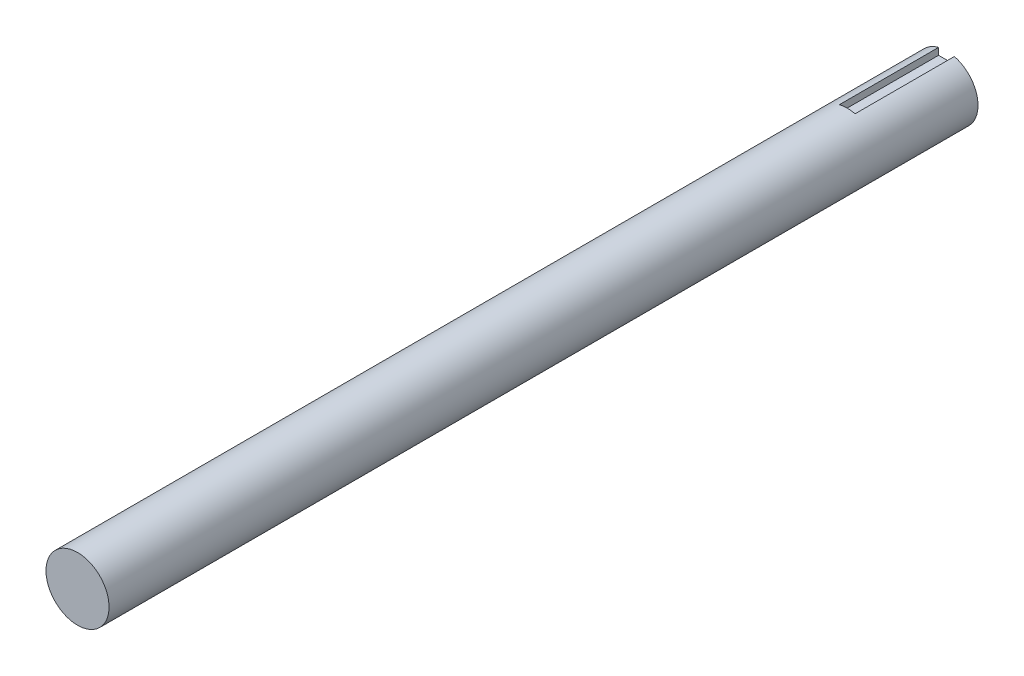
ISO-10303-21;
HEADER;
FILE_DESCRIPTION(('STEP AP214'),'2;1');
FILE_NAME('part.step','',(''),(''),'','','');
FILE_SCHEMA(('AUTOMOTIVE_DESIGN { 1 0 10303 214 1 1 1 1 }'));
ENDSEC;
DATA;
#1=APPLICATION_CONTEXT('core data for automotive mechanical design processes');
#2=APPLICATION_PROTOCOL_DEFINITION('international standard','automotive_design',2000,#1);
#3=PRODUCT_CONTEXT('',#1,'mechanical');
#4=PRODUCT('Part','Part','',(#3));
#5=PRODUCT_RELATED_PRODUCT_CATEGORY('part','',(#4));
#6=PRODUCT_DEFINITION_FORMATION('','',#4);
#7=PRODUCT_DEFINITION_CONTEXT('part definition',#1,'design');
#8=PRODUCT_DEFINITION('design','',#6,#7);
#9=PRODUCT_DEFINITION_SHAPE('','',#8);
#10=(LENGTH_UNIT() NAMED_UNIT(*) SI_UNIT(.MILLI.,.METRE.));
#11=(NAMED_UNIT(*) PLANE_ANGLE_UNIT() SI_UNIT($,.RADIAN.));
#12=(NAMED_UNIT(*) SI_UNIT($,.STERADIAN.) SOLID_ANGLE_UNIT());
#13=UNCERTAINTY_MEASURE_WITH_UNIT(LENGTH_MEASURE(1.E-05),#10,'distance_accuracy_value','');
#14=(GEOMETRIC_REPRESENTATION_CONTEXT(3) GLOBAL_UNCERTAINTY_ASSIGNED_CONTEXT((#13)) GLOBAL_UNIT_ASSIGNED_CONTEXT((#10,
#11,#12)) REPRESENTATION_CONTEXT('',''));
#15=CARTESIAN_POINT('',(0.,0.,0.));
#16=DIRECTION('',(0.,0.,1.));
#17=DIRECTION('',(1.,0.,0.));
#18=AXIS2_PLACEMENT_3D('',#15,#16,#17);
#19=CARTESIAN_POINT('',(0.,0.,155.));
#20=DIRECTION('',(0.,0.,1.));
#21=DIRECTION('',(1.,0.,0.));
#22=AXIS2_PLACEMENT_3D('',#19,#20,#21);
#23=CYLINDRICAL_SURFACE('',#22,12.7);
#24=CARTESIAN_POINT('',(0.,0.,-150.));
#25=DIRECTION('',(0.,0.,1.));
#26=DIRECTION('',(1.,0.,0.));
#27=AXIS2_PLACEMENT_3D('',#24,#25,#26);
#28=CIRCLE('',#27,12.7);
#29=CARTESIAN_POINT('',(3.175,12.2967221242085,-150.));
#30=VERTEX_POINT('',#29);
#31=CARTESIAN_POINT('',(-3.175,12.2967221242085,-150.));
#32=VERTEX_POINT('',#31);
#33=EDGE_CURVE('E48',#30,#32,#28,.T.);
#34=ORIENTED_EDGE('',*,*,#33,.T.);
#35=DIRECTION('',(0.,0.,-1.));
#36=VECTOR('',#35,1.);
#37=CARTESIAN_POINT('',(-3.175,12.2967221242085,-155.));
#38=LINE('',#37,#36);
#39=CARTESIAN_POINT('',(-3.175,12.2967221242085,-190.));
#40=VERTEX_POINT('',#39);
#41=EDGE_CURVE('E81',#40,#32,#38,.F.);
#42=ORIENTED_EDGE('',*,*,#41,.F.);
#43=CARTESIAN_POINT('',(0.,0.,-190.));
#44=DIRECTION('',(0.,0.,-1.));
#45=DIRECTION('',(-1.,0.,0.));
#46=AXIS2_PLACEMENT_3D('',#43,#44,#45);
#47=CIRCLE('',#46,12.7);
#48=CARTESIAN_POINT('',(3.175,12.2967221242085,-190.));
#49=VERTEX_POINT('',#48);
#50=EDGE_CURVE('E77',#49,#40,#47,.T.);
#51=ORIENTED_EDGE('',*,*,#50,.F.);
#52=DIRECTION('',(0.,0.,-1.));
#53=VECTOR('',#52,1.);
#54=CARTESIAN_POINT('',(3.175,12.2967221242085,-155.));
#55=LINE('',#54,#53);
#56=EDGE_CURVE('E74',#30,#49,#55,.T.);
#57=ORIENTED_EDGE('',*,*,#56,.F.);
#58=EDGE_LOOP('',(#34,#42,#51,#57));
#59=FACE_BOUND('',#58,.T.);
#60=CARTESIAN_POINT('',(0.,0.,160.));
#61=DIRECTION('',(0.,0.,-1.));
#62=DIRECTION('',(-1.,0.,0.));
#63=AXIS2_PLACEMENT_3D('',#60,#61,#62);
#64=CIRCLE('',#63,12.7);
#65=CARTESIAN_POINT('',(-12.7,0.,160.));
#66=VERTEX_POINT('',#65);
#67=EDGE_CURVE('E41',#66,#66,#64,.T.);
#68=ORIENTED_EDGE('',*,*,#67,.T.);
#69=EDGE_LOOP('',(#68));
#70=FACE_BOUND('',#69,.T.);
#71=ADVANCED_FACE('F33',(#59,#70),#23,.T.);
#72=CARTESIAN_POINT('',(0.,0.,160.));
#73=DIRECTION('',(0.,0.,-1.));
#74=DIRECTION('',(-1.,0.,0.));
#75=AXIS2_PLACEMENT_3D('',#72,#73,#74);
#76=PLANE('',#75);
#77=ORIENTED_EDGE('',*,*,#67,.F.);
#78=EDGE_LOOP('',(#77));
#79=FACE_BOUND('',#78,.T.);
#80=ADVANCED_FACE('F35',(#79),#76,.F.);
#81=CARTESIAN_POINT('',(0.,0.,-190.));
#82=DIRECTION('',(0.,0.,-1.));
#83=DIRECTION('',(-1.,0.,0.));
#84=AXIS2_PLACEMENT_3D('',#81,#82,#83);
#85=PLANE('',#84);
#86=DIRECTION('',(0.,-1.,0.));
#87=VECTOR('',#86,1.);
#88=CARTESIAN_POINT('',(3.175,0.,-190.));
#89=LINE('',#88,#87);
#90=CARTESIAN_POINT('',(3.175,9.525,-190.));
#91=VERTEX_POINT('',#90);
#92=EDGE_CURVE('E11',#49,#91,#89,.T.);
#93=ORIENTED_EDGE('',*,*,#92,.F.);
#94=ORIENTED_EDGE('',*,*,#50,.T.);
#95=DIRECTION('',(0.,1.,0.));
#96=VECTOR('',#95,1.);
#97=CARTESIAN_POINT('',(-3.175,15.875,-190.));
#98=LINE('',#97,#96);
#99=CARTESIAN_POINT('',(-3.175,9.525,-190.));
#100=VERTEX_POINT('',#99);
#101=EDGE_CURVE('E94',#100,#40,#98,.T.);
#102=ORIENTED_EDGE('',*,*,#101,.F.);
#103=DIRECTION('',(-1.,0.,0.));
#104=VECTOR('',#103,1.);
#105=CARTESIAN_POINT('',(-3.175,9.525,-190.));
#106=LINE('',#105,#104);
#107=EDGE_CURVE('E90',#91,#100,#106,.T.);
#108=ORIENTED_EDGE('',*,*,#107,.F.);
#109=EDGE_LOOP('',(#93,#94,#102,#108));
#110=FACE_BOUND('',#109,.T.);
#111=ADVANCED_FACE('F109',(#110),#85,.T.);
#112=CARTESIAN_POINT('',(-3.175,9.525,-150.));
#113=DIRECTION('',(0.,-1.,0.));
#114=DIRECTION('',(0.,0.,-1.));
#115=AXIS2_PLACEMENT_3D('',#112,#113,#114);
#116=PLANE('',#115);
#117=ORIENTED_EDGE('',*,*,#107,.T.);
#118=DIRECTION('',(0.,0.,-1.));
#119=VECTOR('',#118,1.);
#120=CARTESIAN_POINT('',(-3.175,9.525,-150.));
#121=LINE('',#120,#119);
#122=CARTESIAN_POINT('',(-3.175,9.525,-150.));
#123=VERTEX_POINT('',#122);
#124=EDGE_CURVE('E101',#123,#100,#121,.T.);
#125=ORIENTED_EDGE('',*,*,#124,.F.);
#126=DIRECTION('',(-1.,0.,0.));
#127=VECTOR('',#126,1.);
#128=CARTESIAN_POINT('',(-3.175,9.525,-150.));
#129=LINE('',#128,#127);
#130=CARTESIAN_POINT('',(3.175,9.525,-150.));
#131=VERTEX_POINT('',#130);
#132=EDGE_CURVE('E93',#131,#123,#129,.T.);
#133=ORIENTED_EDGE('',*,*,#132,.F.);
#134=DIRECTION('',(0.,0.,-1.));
#135=VECTOR('',#134,1.);
#136=CARTESIAN_POINT('',(3.175,9.525,-150.));
#137=LINE('',#136,#135);
#138=EDGE_CURVE('E56',#131,#91,#137,.T.);
#139=ORIENTED_EDGE('',*,*,#138,.T.);
#140=EDGE_LOOP('',(#117,#125,#133,#139));
#141=FACE_BOUND('',#140,.T.);
#142=ADVANCED_FACE('F114',(#141),#116,.F.);
#143=CARTESIAN_POINT('',(-3.175,15.875,-150.));
#144=DIRECTION('',(-1.,0.,0.));
#145=DIRECTION('',(0.,-1.,0.));
#146=AXIS2_PLACEMENT_3D('',#143,#144,#145);
#147=PLANE('',#146);
#148=ORIENTED_EDGE('',*,*,#41,.T.);
#149=DIRECTION('',(0.,1.,0.));
#150=VECTOR('',#149,1.);
#151=CARTESIAN_POINT('',(-3.175,15.875,-150.));
#152=LINE('',#151,#150);
#153=EDGE_CURVE('E89',#123,#32,#152,.T.);
#154=ORIENTED_EDGE('',*,*,#153,.F.);
#155=ORIENTED_EDGE('',*,*,#124,.T.);
#156=ORIENTED_EDGE('',*,*,#101,.T.);
#157=EDGE_LOOP('',(#148,#154,#155,#156));
#158=FACE_BOUND('',#157,.T.);
#159=ADVANCED_FACE('F122',(#158),#147,.F.);
#160=CARTESIAN_POINT('',(3.175,15.875,-150.));
#161=DIRECTION('',(1.,0.,0.));
#162=DIRECTION('',(0.,1.,0.));
#163=AXIS2_PLACEMENT_3D('',#160,#161,#162);
#164=PLANE('',#163);
#165=DIRECTION('',(0.,-1.,0.));
#166=VECTOR('',#165,1.);
#167=CARTESIAN_POINT('',(3.175,15.875,-150.));
#168=LINE('',#167,#166);
#169=EDGE_CURVE('E87',#30,#131,#168,.T.);
#170=ORIENTED_EDGE('',*,*,#169,.F.);
#171=ORIENTED_EDGE('',*,*,#56,.T.);
#172=ORIENTED_EDGE('',*,*,#92,.T.);
#173=ORIENTED_EDGE('',*,*,#138,.F.);
#174=EDGE_LOOP('',(#170,#171,#172,#173));
#175=FACE_BOUND('',#174,.T.);
#176=ADVANCED_FACE('F92',(#175),#164,.F.);
#177=CARTESIAN_POINT('',(0.,0.,-150.));
#178=DIRECTION('',(0.,0.,1.));
#179=DIRECTION('',(1.,0.,0.));
#180=AXIS2_PLACEMENT_3D('',#177,#178,#179);
#181=PLANE('',#180);
#182=ORIENTED_EDGE('',*,*,#33,.F.);
#183=ORIENTED_EDGE('',*,*,#169,.T.);
#184=ORIENTED_EDGE('',*,*,#132,.T.);
#185=ORIENTED_EDGE('',*,*,#153,.T.);
#186=EDGE_LOOP('',(#182,#183,#184,#185));
#187=FACE_BOUND('',#186,.T.);
#188=ADVANCED_FACE('F85',(#187),#181,.F.);
#189=CLOSED_SHELL('',(#71,#80,#111,#142,#159,#176,#188));
#190=MANIFOLD_SOLID_BREP('B2',#189);
#191=ADVANCED_BREP_SHAPE_REPRESENTATION('',(#18,#190),#14);
#192=SHAPE_DEFINITION_REPRESENTATION(#9,#191);
ENDSEC;
END-ISO-10303-21;
